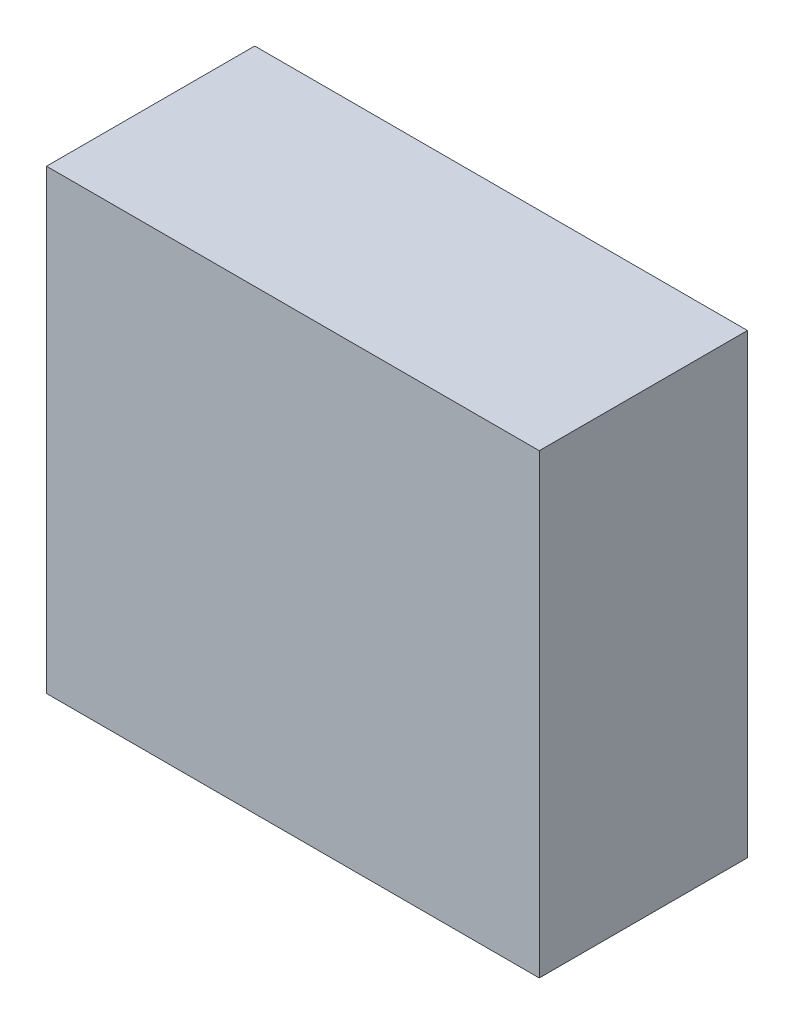
ISO-10303-21;
HEADER;
FILE_DESCRIPTION(('STEP AP214'),'2;1');
FILE_NAME('part.step','',(''),(''),'','','');
FILE_SCHEMA(('AUTOMOTIVE_DESIGN { 1 0 10303 214 1 1 1 1 }'));
ENDSEC;
DATA;
#1=APPLICATION_CONTEXT('core data for automotive mechanical design processes');
#2=APPLICATION_PROTOCOL_DEFINITION('international standard','automotive_design',2000,#1);
#3=PRODUCT_CONTEXT('',#1,'mechanical');
#4=PRODUCT('Part','Part','',(#3));
#5=PRODUCT_RELATED_PRODUCT_CATEGORY('part','',(#4));
#6=PRODUCT_DEFINITION_FORMATION('','',#4);
#7=PRODUCT_DEFINITION_CONTEXT('part definition',#1,'design');
#8=PRODUCT_DEFINITION('design','',#6,#7);
#9=PRODUCT_DEFINITION_SHAPE('','',#8);
#10=(LENGTH_UNIT() NAMED_UNIT(*) SI_UNIT(.MILLI.,.METRE.));
#11=(NAMED_UNIT(*) PLANE_ANGLE_UNIT() SI_UNIT($,.RADIAN.));
#12=(NAMED_UNIT(*) SI_UNIT($,.STERADIAN.) SOLID_ANGLE_UNIT());
#13=UNCERTAINTY_MEASURE_WITH_UNIT(LENGTH_MEASURE(1.E-05),#10,'distance_accuracy_value','');
#14=(GEOMETRIC_REPRESENTATION_CONTEXT(3) GLOBAL_UNCERTAINTY_ASSIGNED_CONTEXT((#13)) GLOBAL_UNIT_ASSIGNED_CONTEXT((#10,
#11,#12)) REPRESENTATION_CONTEXT('',''));
#15=CARTESIAN_POINT('',(0.,0.,0.));
#16=DIRECTION('',(0.,0.,1.));
#17=DIRECTION('',(1.,0.,0.));
#18=AXIS2_PLACEMENT_3D('',#15,#16,#17);
#19=CARTESIAN_POINT('',(90.17,83.566,38.1));
#20=DIRECTION('',(-1.,0.,0.));
#21=DIRECTION('',(0.,-1.,0.));
#22=AXIS2_PLACEMENT_3D('',#19,#20,#21);
#23=PLANE('',#22);
#24=DIRECTION('',(0.,1.,0.));
#25=VECTOR('',#24,1.);
#26=CARTESIAN_POINT('',(90.17,83.566,-38.1));
#27=LINE('',#26,#25);
#28=CARTESIAN_POINT('',(90.17,-83.566,-38.1));
#29=VERTEX_POINT('',#28);
#30=CARTESIAN_POINT('',(90.17,83.566,-38.1));
#31=VERTEX_POINT('',#30);
#32=EDGE_CURVE('E107',#29,#31,#27,.T.);
#33=ORIENTED_EDGE('',*,*,#32,.T.);
#34=DIRECTION('',(0.,0.,-1.));
#35=VECTOR('',#34,1.);
#36=CARTESIAN_POINT('',(90.17,83.566,38.1));
#37=LINE('',#36,#35);
#38=CARTESIAN_POINT('',(90.17,83.566,38.1));
#39=VERTEX_POINT('',#38);
#40=EDGE_CURVE('E11',#39,#31,#37,.T.);
#41=ORIENTED_EDGE('',*,*,#40,.F.);
#42=DIRECTION('',(0.,1.,0.));
#43=VECTOR('',#42,1.);
#44=CARTESIAN_POINT('',(90.17,83.566,38.1));
#45=LINE('',#44,#43);
#46=CARTESIAN_POINT('',(90.17,-83.566,38.1));
#47=VERTEX_POINT('',#46);
#48=EDGE_CURVE('E91',#47,#39,#45,.T.);
#49=ORIENTED_EDGE('',*,*,#48,.F.);
#50=DIRECTION('',(0.,0.,-1.));
#51=VECTOR('',#50,1.);
#52=CARTESIAN_POINT('',(90.17,-83.566,38.1));
#53=LINE('',#52,#51);
#54=EDGE_CURVE('E103',#47,#29,#53,.T.);
#55=ORIENTED_EDGE('',*,*,#54,.T.);
#56=EDGE_LOOP('',(#33,#41,#49,#55));
#57=FACE_BOUND('',#56,.T.);
#58=ADVANCED_FACE('F39',(#57),#23,.F.);
#59=CARTESIAN_POINT('',(-90.17,83.566,38.1));
#60=DIRECTION('',(0.,-1.,0.));
#61=DIRECTION('',(0.,0.,-1.));
#62=AXIS2_PLACEMENT_3D('',#59,#60,#61);
#63=PLANE('',#62);
#64=DIRECTION('',(-1.,0.,0.));
#65=VECTOR('',#64,1.);
#66=CARTESIAN_POINT('',(-90.17,83.566,-38.1));
#67=LINE('',#66,#65);
#68=CARTESIAN_POINT('',(-90.17,83.566,-38.1));
#69=VERTEX_POINT('',#68);
#70=EDGE_CURVE('E96',#31,#69,#67,.T.);
#71=ORIENTED_EDGE('',*,*,#70,.T.);
#72=DIRECTION('',(0.,0.,-1.));
#73=VECTOR('',#72,1.);
#74=CARTESIAN_POINT('',(-90.17,83.566,38.1));
#75=LINE('',#74,#73);
#76=CARTESIAN_POINT('',(-90.17,83.566,38.1));
#77=VERTEX_POINT('',#76);
#78=EDGE_CURVE('E48',#77,#69,#75,.T.);
#79=ORIENTED_EDGE('',*,*,#78,.F.);
#80=DIRECTION('',(-1.,0.,0.));
#81=VECTOR('',#80,1.);
#82=CARTESIAN_POINT('',(-90.17,83.566,38.1));
#83=LINE('',#82,#81);
#84=EDGE_CURVE('E86',#39,#77,#83,.T.);
#85=ORIENTED_EDGE('',*,*,#84,.F.);
#86=ORIENTED_EDGE('',*,*,#40,.T.);
#87=EDGE_LOOP('',(#71,#79,#85,#86));
#88=FACE_BOUND('',#87,.T.);
#89=ADVANCED_FACE('F95',(#88),#63,.F.);
#90=CARTESIAN_POINT('',(-90.17,83.566,38.1));
#91=DIRECTION('',(1.,0.,0.));
#92=DIRECTION('',(0.,1.,0.));
#93=AXIS2_PLACEMENT_3D('',#90,#91,#92);
#94=PLANE('',#93);
#95=DIRECTION('',(0.,-1.,0.));
#96=VECTOR('',#95,1.);
#97=CARTESIAN_POINT('',(-90.17,83.566,-38.1));
#98=LINE('',#97,#96);
#99=CARTESIAN_POINT('',(-90.17,-83.566,-38.1));
#100=VERTEX_POINT('',#99);
#101=EDGE_CURVE('E73',#69,#100,#98,.T.);
#102=ORIENTED_EDGE('',*,*,#101,.T.);
#103=DIRECTION('',(0.,0.,-1.));
#104=VECTOR('',#103,1.);
#105=CARTESIAN_POINT('',(-90.17,-83.566,38.1));
#106=LINE('',#105,#104);
#107=CARTESIAN_POINT('',(-90.17,-83.566,38.1));
#108=VERTEX_POINT('',#107);
#109=EDGE_CURVE('E98',#108,#100,#106,.T.);
#110=ORIENTED_EDGE('',*,*,#109,.F.);
#111=DIRECTION('',(0.,-1.,0.));
#112=VECTOR('',#111,1.);
#113=CARTESIAN_POINT('',(-90.17,83.566,38.1));
#114=LINE('',#113,#112);
#115=EDGE_CURVE('E89',#77,#108,#114,.T.);
#116=ORIENTED_EDGE('',*,*,#115,.F.);
#117=ORIENTED_EDGE('',*,*,#78,.T.);
#118=EDGE_LOOP('',(#102,#110,#116,#117));
#119=FACE_BOUND('',#118,.T.);
#120=ADVANCED_FACE('F99',(#119),#94,.F.);
#121=CARTESIAN_POINT('',(-90.17,-83.566,38.1));
#122=DIRECTION('',(0.,1.,0.));
#123=DIRECTION('',(0.,0.,1.));
#124=AXIS2_PLACEMENT_3D('',#121,#122,#123);
#125=PLANE('',#124);
#126=DIRECTION('',(1.,0.,0.));
#127=VECTOR('',#126,1.);
#128=CARTESIAN_POINT('',(-90.17,-83.566,-38.1));
#129=LINE('',#128,#127);
#130=EDGE_CURVE('E79',#100,#29,#129,.T.);
#131=ORIENTED_EDGE('',*,*,#130,.T.);
#132=ORIENTED_EDGE('',*,*,#54,.F.);
#133=DIRECTION('',(1.,0.,0.));
#134=VECTOR('',#133,1.);
#135=CARTESIAN_POINT('',(-90.17,-83.566,38.1));
#136=LINE('',#135,#134);
#137=EDGE_CURVE('E56',#108,#47,#136,.T.);
#138=ORIENTED_EDGE('',*,*,#137,.F.);
#139=ORIENTED_EDGE('',*,*,#109,.T.);
#140=EDGE_LOOP('',(#131,#132,#138,#139));
#141=FACE_BOUND('',#140,.T.);
#142=ADVANCED_FACE('F120',(#141),#125,.F.);
#143=CARTESIAN_POINT('',(0.,0.,38.1));
#144=DIRECTION('',(0.,0.,1.));
#145=DIRECTION('',(1.,0.,0.));
#146=AXIS2_PLACEMENT_3D('',#143,#144,#145);
#147=PLANE('',#146);
#148=ORIENTED_EDGE('',*,*,#48,.T.);
#149=ORIENTED_EDGE('',*,*,#84,.T.);
#150=ORIENTED_EDGE('',*,*,#115,.T.);
#151=ORIENTED_EDGE('',*,*,#137,.T.);
#152=EDGE_LOOP('',(#148,#149,#150,#151));
#153=FACE_BOUND('',#152,.T.);
#154=ADVANCED_FACE('F87',(#153),#147,.T.);
#155=CARTESIAN_POINT('',(0.,0.,-38.1));
#156=DIRECTION('',(0.,0.,1.));
#157=DIRECTION('',(1.,0.,0.));
#158=AXIS2_PLACEMENT_3D('',#155,#156,#157);
#159=PLANE('',#158);
#160=ORIENTED_EDGE('',*,*,#32,.F.);
#161=ORIENTED_EDGE('',*,*,#130,.F.);
#162=ORIENTED_EDGE('',*,*,#101,.F.);
#163=ORIENTED_EDGE('',*,*,#70,.F.);
#164=EDGE_LOOP('',(#160,#161,#162,#163));
#165=FACE_BOUND('',#164,.T.);
#166=ADVANCED_FACE('F123',(#165),#159,.F.);
#167=CLOSED_SHELL('',(#58,#89,#120,#142,#154,#166));
#168=MANIFOLD_SOLID_BREP('B2',#167);
#169=ADVANCED_BREP_SHAPE_REPRESENTATION('',(#18,#168),#14);
#170=SHAPE_DEFINITION_REPRESENTATION(#9,#169);
ENDSEC;
END-ISO-10303-21;
